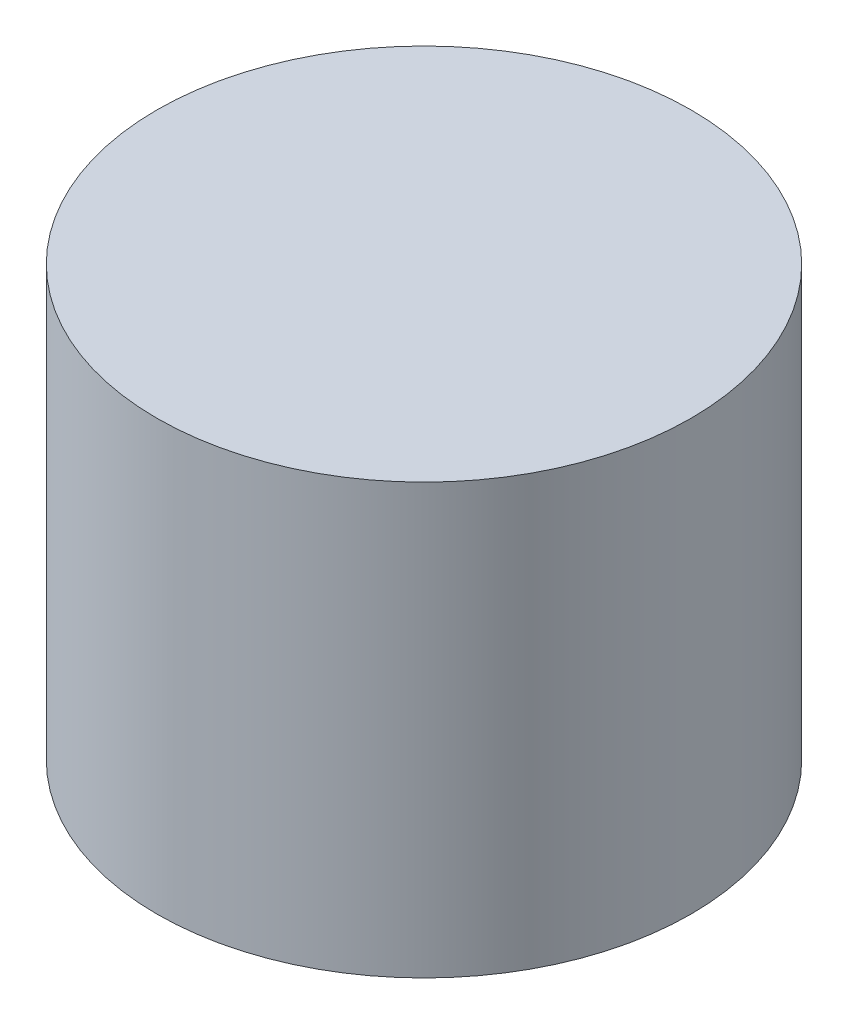
ISO-10303-21;
HEADER;
FILE_DESCRIPTION(('STEP AP214'),'2;1');
FILE_NAME('part.step','',(''),(''),'','','');
FILE_SCHEMA(('AUTOMOTIVE_DESIGN { 1 0 10303 214 1 1 1 1 }'));
ENDSEC;
DATA;
#1=APPLICATION_CONTEXT('core data for automotive mechanical design processes');
#2=APPLICATION_PROTOCOL_DEFINITION('international standard','automotive_design',2000,#1);
#3=PRODUCT_CONTEXT('',#1,'mechanical');
#4=PRODUCT('Part','Part','',(#3));
#5=PRODUCT_RELATED_PRODUCT_CATEGORY('part','',(#4));
#6=PRODUCT_DEFINITION_FORMATION('','',#4);
#7=PRODUCT_DEFINITION_CONTEXT('part definition',#1,'design');
#8=PRODUCT_DEFINITION('design','',#6,#7);
#9=PRODUCT_DEFINITION_SHAPE('','',#8);
#10=(LENGTH_UNIT() NAMED_UNIT(*) SI_UNIT(.MILLI.,.METRE.));
#11=(NAMED_UNIT(*) PLANE_ANGLE_UNIT() SI_UNIT($,.RADIAN.));
#12=(NAMED_UNIT(*) SI_UNIT($,.STERADIAN.) SOLID_ANGLE_UNIT());
#13=UNCERTAINTY_MEASURE_WITH_UNIT(LENGTH_MEASURE(1.E-05),#10,'distance_accuracy_value','');
#14=(GEOMETRIC_REPRESENTATION_CONTEXT(3) GLOBAL_UNCERTAINTY_ASSIGNED_CONTEXT((#13)) GLOBAL_UNIT_ASSIGNED_CONTEXT((#10,
#11,#12)) REPRESENTATION_CONTEXT('',''));
#15=CARTESIAN_POINT('',(0.,0.,0.));
#16=DIRECTION('',(0.,0.,1.));
#17=DIRECTION('',(1.,0.,0.));
#18=AXIS2_PLACEMENT_3D('',#15,#16,#17);
#19=CARTESIAN_POINT('',(0.,20.5,0.));
#20=DIRECTION('',(0.,-1.,0.));
#21=DIRECTION('',(0.,0.,-1.));
#22=AXIS2_PLACEMENT_3D('',#19,#20,#21);
#23=CYLINDRICAL_SURFACE('',#22,12.75);
#24=CARTESIAN_POINT('',(0.,20.5,0.));
#25=DIRECTION('',(0.,1.,0.));
#26=DIRECTION('',(0.,0.,1.));
#27=AXIS2_PLACEMENT_3D('',#24,#25,#26);
#28=CIRCLE('',#27,12.75);
#29=CARTESIAN_POINT('',(0.,20.5,12.75));
#30=VERTEX_POINT('',#29);
#31=EDGE_CURVE('E10',#30,#30,#28,.T.);
#32=ORIENTED_EDGE('',*,*,#31,.F.);
#33=EDGE_LOOP('',(#32));
#34=FACE_BOUND('',#33,.T.);
#35=CARTESIAN_POINT('',(0.,0.,0.));
#36=DIRECTION('',(0.,1.,0.));
#37=DIRECTION('',(0.,0.,1.));
#38=AXIS2_PLACEMENT_3D('',#35,#36,#37);
#39=CIRCLE('',#38,12.75);
#40=CARTESIAN_POINT('',(0.,0.,12.75));
#41=VERTEX_POINT('',#40);
#42=EDGE_CURVE('E42',#41,#41,#39,.T.);
#43=ORIENTED_EDGE('',*,*,#42,.T.);
#44=EDGE_LOOP('',(#43));
#45=FACE_BOUND('',#44,.T.);
#46=ADVANCED_FACE('F39',(#34,#45),#23,.T.);
#47=CARTESIAN_POINT('',(0.,20.5,0.));
#48=DIRECTION('',(0.,1.,0.));
#49=DIRECTION('',(0.,0.,1.));
#50=AXIS2_PLACEMENT_3D('',#47,#48,#49);
#51=PLANE('',#50);
#52=ORIENTED_EDGE('',*,*,#31,.T.);
#53=EDGE_LOOP('',(#52));
#54=FACE_BOUND('',#53,.T.);
#55=ADVANCED_FACE('F54',(#54),#51,.T.);
#56=CARTESIAN_POINT('',(0.,0.,0.));
#57=DIRECTION('',(0.,1.,0.));
#58=DIRECTION('',(0.,0.,1.));
#59=AXIS2_PLACEMENT_3D('',#56,#57,#58);
#60=PLANE('',#59);
#61=ORIENTED_EDGE('',*,*,#42,.F.);
#62=EDGE_LOOP('',(#61));
#63=FACE_BOUND('',#62,.T.);
#64=ADVANCED_FACE('F52',(#63),#60,.F.);
#65=CLOSED_SHELL('',(#46,#55,#64));
#66=MANIFOLD_SOLID_BREP('B2',#65);
#67=ADVANCED_BREP_SHAPE_REPRESENTATION('',(#18,#66),#14);
#68=SHAPE_DEFINITION_REPRESENTATION(#9,#67);
ENDSEC;
END-ISO-10303-21;
